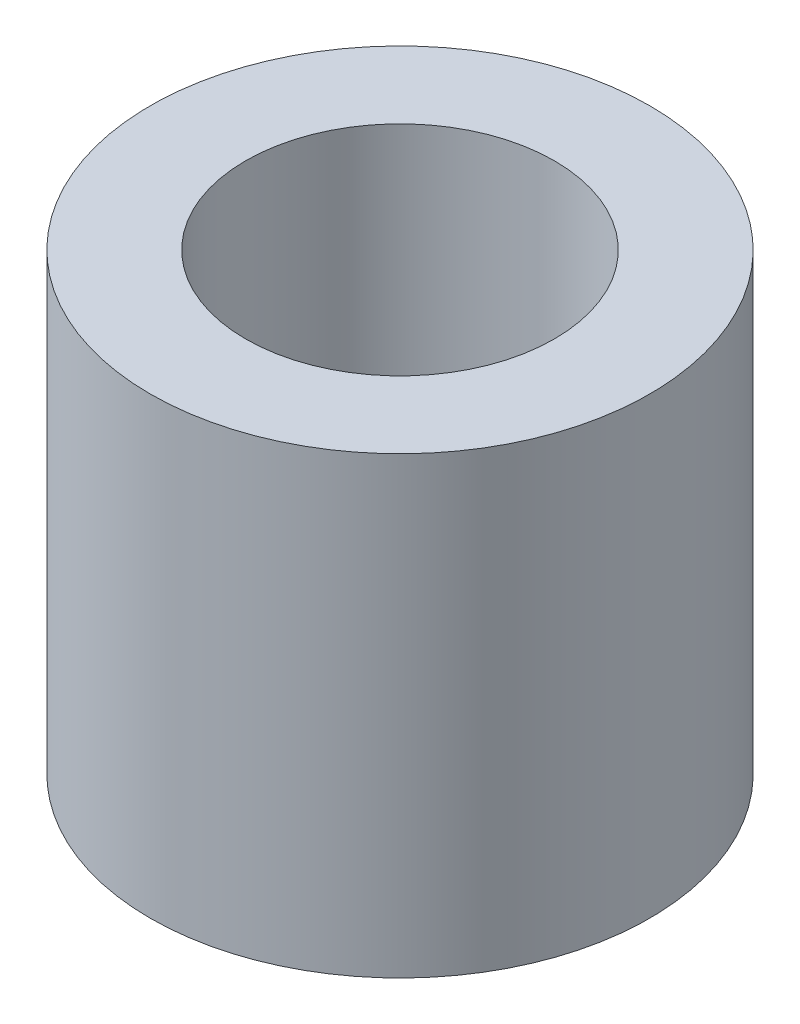
ISO-10303-21;
HEADER;
FILE_DESCRIPTION(('STEP AP214'),'2;1');
FILE_NAME('part.step','',(''),(''),'','','');
FILE_SCHEMA(('AUTOMOTIVE_DESIGN { 1 0 10303 214 1 1 1 1 }'));
ENDSEC;
DATA;
#1=APPLICATION_CONTEXT('core data for automotive mechanical design processes');
#2=APPLICATION_PROTOCOL_DEFINITION('international standard','automotive_design',2000,#1);
#3=PRODUCT_CONTEXT('',#1,'mechanical');
#4=PRODUCT('Part','Part','',(#3));
#5=PRODUCT_RELATED_PRODUCT_CATEGORY('part','',(#4));
#6=PRODUCT_DEFINITION_FORMATION('','',#4);
#7=PRODUCT_DEFINITION_CONTEXT('part definition',#1,'design');
#8=PRODUCT_DEFINITION('design','',#6,#7);
#9=PRODUCT_DEFINITION_SHAPE('','',#8);
#10=(LENGTH_UNIT() NAMED_UNIT(*) SI_UNIT(.MILLI.,.METRE.));
#11=(NAMED_UNIT(*) PLANE_ANGLE_UNIT() SI_UNIT($,.RADIAN.));
#12=(NAMED_UNIT(*) SI_UNIT($,.STERADIAN.) SOLID_ANGLE_UNIT());
#13=UNCERTAINTY_MEASURE_WITH_UNIT(LENGTH_MEASURE(1.E-05),#10,'distance_accuracy_value','');
#14=(GEOMETRIC_REPRESENTATION_CONTEXT(3) GLOBAL_UNCERTAINTY_ASSIGNED_CONTEXT((#13)) GLOBAL_UNIT_ASSIGNED_CONTEXT((#10,
#11,#12)) REPRESENTATION_CONTEXT('',''));
#15=CARTESIAN_POINT('',(0.,0.,0.));
#16=DIRECTION('',(0.,0.,1.));
#17=DIRECTION('',(1.,0.,0.));
#18=AXIS2_PLACEMENT_3D('',#15,#16,#17);
#19=CARTESIAN_POINT('',(0.,5.,0.));
#20=DIRECTION('',(0.,1.,0.));
#21=DIRECTION('',(0.,0.,1.));
#22=AXIS2_PLACEMENT_3D('',#19,#20,#21);
#23=PLANE('',#22);
#24=CARTESIAN_POINT('',(0.,5.,0.));
#25=DIRECTION('',(0.,1.,0.));
#26=DIRECTION('',(0.,0.,1.));
#27=AXIS2_PLACEMENT_3D('',#24,#25,#26);
#28=CIRCLE('',#27,2.75);
#29=CARTESIAN_POINT('',(0.,5.,2.75));
#30=VERTEX_POINT('',#29);
#31=EDGE_CURVE('E10',#30,#30,#28,.T.);
#32=ORIENTED_EDGE('',*,*,#31,.T.);
#33=EDGE_LOOP('',(#32));
#34=FACE_BOUND('',#33,.T.);
#35=CARTESIAN_POINT('',(0.,5.,0.));
#36=DIRECTION('',(0.,1.,0.));
#37=DIRECTION('',(0.,0.,1.));
#38=AXIS2_PLACEMENT_3D('',#35,#36,#37);
#39=CIRCLE('',#38,1.7);
#40=CARTESIAN_POINT('',(0.,5.,1.7));
#41=VERTEX_POINT('',#40);
#42=EDGE_CURVE('E50',#41,#41,#39,.T.);
#43=ORIENTED_EDGE('',*,*,#42,.F.);
#44=EDGE_LOOP('',(#43));
#45=FACE_BOUND('',#44,.T.);
#46=ADVANCED_FACE('F37',(#34,#45),#23,.T.);
#47=CARTESIAN_POINT('',(0.,0.,0.));
#48=DIRECTION('',(0.,1.,0.));
#49=DIRECTION('',(0.,0.,1.));
#50=AXIS2_PLACEMENT_3D('',#47,#48,#49);
#51=PLANE('',#50);
#52=CARTESIAN_POINT('',(0.,0.,0.));
#53=DIRECTION('',(0.,1.,0.));
#54=DIRECTION('',(0.,0.,1.));
#55=AXIS2_PLACEMENT_3D('',#52,#53,#54);
#56=CIRCLE('',#55,2.75);
#57=CARTESIAN_POINT('',(0.,0.,2.75));
#58=VERTEX_POINT('',#57);
#59=EDGE_CURVE('E41',#58,#58,#56,.T.);
#60=ORIENTED_EDGE('',*,*,#59,.F.);
#61=EDGE_LOOP('',(#60));
#62=FACE_BOUND('',#61,.T.);
#63=CARTESIAN_POINT('',(0.,0.,0.));
#64=DIRECTION('',(0.,1.,0.));
#65=DIRECTION('',(0.,0.,1.));
#66=AXIS2_PLACEMENT_3D('',#63,#64,#65);
#67=CIRCLE('',#66,1.7);
#68=CARTESIAN_POINT('',(0.,0.,1.7));
#69=VERTEX_POINT('',#68);
#70=EDGE_CURVE('E52',#69,#69,#67,.T.);
#71=ORIENTED_EDGE('',*,*,#70,.T.);
#72=EDGE_LOOP('',(#71));
#73=FACE_BOUND('',#72,.T.);
#74=ADVANCED_FACE('F64',(#62,#73),#51,.F.);
#75=CARTESIAN_POINT('',(0.,5.,0.));
#76=DIRECTION('',(0.,-1.,0.));
#77=DIRECTION('',(0.,0.,-1.));
#78=AXIS2_PLACEMENT_3D('',#75,#76,#77);
#79=CYLINDRICAL_SURFACE('',#78,2.75);
#80=ORIENTED_EDGE('',*,*,#31,.F.);
#81=EDGE_LOOP('',(#80));
#82=FACE_BOUND('',#81,.T.);
#83=ORIENTED_EDGE('',*,*,#59,.T.);
#84=EDGE_LOOP('',(#83));
#85=FACE_BOUND('',#84,.T.);
#86=ADVANCED_FACE('F39',(#82,#85),#79,.T.);
#87=CARTESIAN_POINT('',(0.,5.,0.));
#88=DIRECTION('',(0.,-1.,0.));
#89=DIRECTION('',(0.,0.,-1.));
#90=AXIS2_PLACEMENT_3D('',#87,#88,#89);
#91=CYLINDRICAL_SURFACE('',#90,1.7);
#92=ORIENTED_EDGE('',*,*,#42,.T.);
#93=EDGE_LOOP('',(#92));
#94=FACE_BOUND('',#93,.T.);
#95=ORIENTED_EDGE('',*,*,#70,.F.);
#96=EDGE_LOOP('',(#95));
#97=FACE_BOUND('',#96,.T.);
#98=ADVANCED_FACE('F60',(#94,#97),#91,.F.);
#99=CLOSED_SHELL('',(#46,#74,#86,#98));
#100=MANIFOLD_SOLID_BREP('B2',#99);
#101=ADVANCED_BREP_SHAPE_REPRESENTATION('',(#18,#100),#14);
#102=SHAPE_DEFINITION_REPRESENTATION(#9,#101);
ENDSEC;
END-ISO-10303-21;
